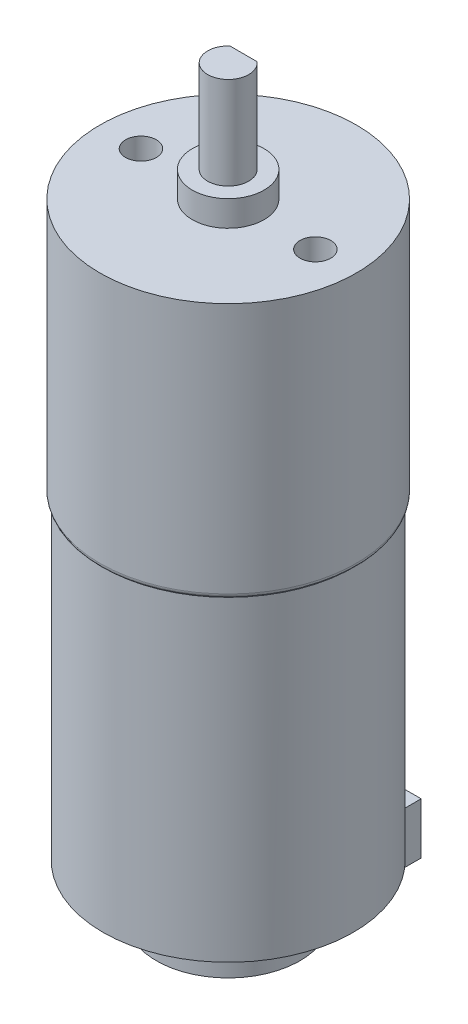
ISO-10303-21;
HEADER;
FILE_DESCRIPTION(('STEP AP214'),'2;1');
FILE_NAME('part.step','',(''),(''),'','','');
FILE_SCHEMA(('AUTOMOTIVE_DESIGN { 1 0 10303 214 1 1 1 1 }'));
ENDSEC;
DATA;
#1=APPLICATION_CONTEXT('core data for automotive mechanical design processes');
#2=APPLICATION_PROTOCOL_DEFINITION('international standard','automotive_design',2000,#1);
#3=PRODUCT_CONTEXT('',#1,'mechanical');
#4=PRODUCT('Part','Part','',(#3));
#5=PRODUCT_RELATED_PRODUCT_CATEGORY('part','',(#4));
#6=PRODUCT_DEFINITION_FORMATION('','',#4);
#7=PRODUCT_DEFINITION_CONTEXT('part definition',#1,'design');
#8=PRODUCT_DEFINITION('design','',#6,#7);
#9=PRODUCT_DEFINITION_SHAPE('','',#8);
#10=(LENGTH_UNIT() NAMED_UNIT(*) SI_UNIT(.MILLI.,.METRE.));
#11=(NAMED_UNIT(*) PLANE_ANGLE_UNIT() SI_UNIT($,.RADIAN.));
#12=(NAMED_UNIT(*) SI_UNIT($,.STERADIAN.) SOLID_ANGLE_UNIT());
#13=UNCERTAINTY_MEASURE_WITH_UNIT(LENGTH_MEASURE(1.E-05),#10,'distance_accuracy_value','');
#14=(GEOMETRIC_REPRESENTATION_CONTEXT(3) GLOBAL_UNCERTAINTY_ASSIGNED_CONTEXT((#13)) GLOBAL_UNIT_ASSIGNED_CONTEXT((#10,
#11,#12)) REPRESENTATION_CONTEXT('',''));
#15=CARTESIAN_POINT('',(0.,0.,0.));
#16=DIRECTION('',(0.,0.,1.));
#17=DIRECTION('',(1.,0.,0.));
#18=AXIS2_PLACEMENT_3D('',#15,#16,#17);
#19=CARTESIAN_POINT('',(0.,-30.8,0.));
#20=DIRECTION('',(0.,-1.,0.));
#21=DIRECTION('',(0.,0.,-1.));
#22=AXIS2_PLACEMENT_3D('',#19,#20,#21);
#23=PLANE('',#22);
#24=CARTESIAN_POINT('',(0.,-30.8,0.));
#25=DIRECTION('',(0.,-1.,0.));
#26=DIRECTION('',(0.,0.,-1.));
#27=AXIS2_PLACEMENT_3D('',#24,#25,#26);
#28=CIRCLE('',#27,7.);
#29=CARTESIAN_POINT('',(0.,-30.8,-7.));
#30=VERTEX_POINT('',#29);
#31=EDGE_CURVE('E46',#30,#30,#28,.T.);
#32=ORIENTED_EDGE('',*,*,#31,.F.);
#33=EDGE_LOOP('',(#32));
#34=FACE_BOUND('',#33,.T.);
#35=DIRECTION('',(-1.,0.,0.));
#36=VECTOR('',#35,1.);
#37=CARTESIAN_POINT('',(-4.22657274734341,-30.8,-10.4201274271041));
#38=LINE('',#37,#36);
#39=CARTESIAN_POINT('',(4.22657274734341,-30.8,-10.4201274271041));
#40=VERTEX_POINT('',#39);
#41=CARTESIAN_POINT('',(-4.22657274734341,-30.8,-10.4201274271041));
#42=VERTEX_POINT('',#41);
#43=EDGE_CURVE('E421',#40,#42,#38,.T.);
#44=ORIENTED_EDGE('',*,*,#43,.F.);
#45=DIRECTION('',(0.,0.,-1.));
#46=VECTOR('',#45,1.);
#47=CARTESIAN_POINT('',(4.22657274734341,-30.8,0.));
#48=LINE('',#47,#46);
#49=CARTESIAN_POINT('',(4.22657274734341,-30.8,-11.4444782673311));
#50=VERTEX_POINT('',#49);
#51=EDGE_CURVE('E11',#40,#50,#48,.T.);
#52=ORIENTED_EDGE('',*,*,#51,.T.);
#53=CARTESIAN_POINT('',(0.,-30.8,0.));
#54=DIRECTION('',(0.,-1.,0.));
#55=DIRECTION('',(0.,0.,-1.));
#56=AXIS2_PLACEMENT_3D('',#53,#54,#55);
#57=CIRCLE('',#56,12.2);
#58=CARTESIAN_POINT('',(-4.22657274734341,-30.8,-11.4444782673311));
#59=VERTEX_POINT('',#58);
#60=EDGE_CURVE('E167',#50,#59,#57,.T.);
#61=ORIENTED_EDGE('',*,*,#60,.T.);
#62=DIRECTION('',(0.,0.,-1.));
#63=VECTOR('',#62,1.);
#64=CARTESIAN_POINT('',(-4.22657274734341,-30.8,-14.5798725728959));
#65=LINE('',#64,#63);
#66=EDGE_CURVE('E425',#42,#59,#65,.T.);
#67=ORIENTED_EDGE('',*,*,#66,.F.);
#68=EDGE_LOOP('',(#44,#52,#61,#67));
#69=FACE_BOUND('',#68,.T.);
#70=ADVANCED_FACE('F38',(#34,#69),#23,.T.);
#71=CARTESIAN_POINT('',(0.,0.5,0.));
#72=DIRECTION('',(0.,1.,0.));
#73=DIRECTION('',(0.,0.,1.));
#74=AXIS2_PLACEMENT_3D('',#71,#72,#73);
#75=TOROIDAL_SURFACE('',#74,12.,0.5);
#76=CARTESIAN_POINT('',(0.,0.,0.));
#77=DIRECTION('',(0.,1.,0.));
#78=DIRECTION('',(0.,0.,1.));
#79=AXIS2_PLACEMENT_3D('',#76,#77,#78);
#80=CIRCLE('',#79,12.);
#81=CARTESIAN_POINT('',(0.,0.,12.));
#82=VERTEX_POINT('',#81);
#83=EDGE_CURVE('E176',#82,#82,#80,.F.);
#84=ORIENTED_EDGE('',*,*,#83,.F.);
#85=EDGE_LOOP('',(#84));
#86=FACE_BOUND('',#85,.T.);
#87=CARTESIAN_POINT('',(0.,0.5,0.));
#88=DIRECTION('',(0.,1.,0.));
#89=DIRECTION('',(0.,0.,1.));
#90=AXIS2_PLACEMENT_3D('',#87,#88,#89);
#91=CIRCLE('',#90,12.5);
#92=CARTESIAN_POINT('',(0.,0.5,12.5));
#93=VERTEX_POINT('',#92);
#94=EDGE_CURVE('E166',#93,#93,#91,.T.);
#95=ORIENTED_EDGE('',*,*,#94,.F.);
#96=EDGE_LOOP('',(#95));
#97=FACE_BOUND('',#96,.T.);
#98=ADVANCED_FACE('F40',(#86,#97),#75,.T.);
#99=CARTESIAN_POINT('',(0.,25.,0.));
#100=DIRECTION('',(0.,-1.,0.));
#101=DIRECTION('',(0.,0.,-1.));
#102=AXIS2_PLACEMENT_3D('',#99,#100,#101);
#103=CYLINDRICAL_SURFACE('',#102,12.5);
#104=ORIENTED_EDGE('',*,*,#94,.T.);
#105=EDGE_LOOP('',(#104));
#106=FACE_BOUND('',#105,.T.);
#107=CARTESIAN_POINT('',(0.,25.,0.));
#108=DIRECTION('',(0.,1.,0.));
#109=DIRECTION('',(0.,0.,1.));
#110=AXIS2_PLACEMENT_3D('',#107,#108,#109);
#111=CIRCLE('',#110,12.5);
#112=CARTESIAN_POINT('',(0.,25.,12.5));
#113=VERTEX_POINT('',#112);
#114=EDGE_CURVE('E170',#113,#113,#111,.T.);
#115=ORIENTED_EDGE('',*,*,#114,.F.);
#116=EDGE_LOOP('',(#115));
#117=FACE_BOUND('',#116,.T.);
#118=ADVANCED_FACE('F181',(#106,#117),#103,.T.);
#119=CARTESIAN_POINT('',(0.,25.,0.));
#120=DIRECTION('',(0.,1.,0.));
#121=DIRECTION('',(0.,0.,1.));
#122=AXIS2_PLACEMENT_3D('',#119,#120,#121);
#123=PLANE('',#122);
#124=CARTESIAN_POINT('',(-8.5,25.,0.));
#125=DIRECTION('',(0.,1.,0.));
#126=DIRECTION('',(0.,0.,1.));
#127=AXIS2_PLACEMENT_3D('',#124,#125,#126);
#128=CIRCLE('',#127,1.5);
#129=CARTESIAN_POINT('',(-8.5,25.,1.5));
#130=VERTEX_POINT('',#129);
#131=EDGE_CURVE('E136',#130,#130,#128,.T.);
#132=ORIENTED_EDGE('',*,*,#131,.F.);
#133=EDGE_LOOP('',(#132));
#134=FACE_BOUND('',#133,.T.);
#135=CARTESIAN_POINT('',(8.5,25.,0.));
#136=DIRECTION('',(0.,1.,0.));
#137=DIRECTION('',(0.,0.,1.));
#138=AXIS2_PLACEMENT_3D('',#135,#136,#137);
#139=CIRCLE('',#138,1.5);
#140=CARTESIAN_POINT('',(8.5,25.,1.5));
#141=VERTEX_POINT('',#140);
#142=EDGE_CURVE('E123',#141,#141,#139,.T.);
#143=ORIENTED_EDGE('',*,*,#142,.F.);
#144=EDGE_LOOP('',(#143));
#145=FACE_BOUND('',#144,.T.);
#146=CARTESIAN_POINT('',(0.,25.,0.));
#147=DIRECTION('',(0.,1.,0.));
#148=DIRECTION('',(0.,0.,1.));
#149=AXIS2_PLACEMENT_3D('',#146,#147,#148);
#150=CIRCLE('',#149,3.5);
#151=CARTESIAN_POINT('',(0.,25.,3.5));
#152=VERTEX_POINT('',#151);
#153=EDGE_CURVE('E160',#152,#152,#150,.T.);
#154=ORIENTED_EDGE('',*,*,#153,.F.);
#155=EDGE_LOOP('',(#154));
#156=FACE_BOUND('',#155,.T.);
#157=ORIENTED_EDGE('',*,*,#114,.T.);
#158=EDGE_LOOP('',(#157));
#159=FACE_BOUND('',#158,.T.);
#160=ADVANCED_FACE('F190',(#134,#145,#156,#159),#123,.T.);
#161=CARTESIAN_POINT('',(0.,-30.8,0.));
#162=DIRECTION('',(0.,1.,0.));
#163=DIRECTION('',(0.,0.,1.));
#164=AXIS2_PLACEMENT_3D('',#161,#162,#163);
#165=CYLINDRICAL_SURFACE('',#164,12.2);
#166=ORIENTED_EDGE('',*,*,#60,.F.);
#167=EDGE_CURVE('E171',#59,#50,#57,.T.);
#168=ORIENTED_EDGE('',*,*,#167,.F.);
#169=EDGE_LOOP('',(#166,#168));
#170=FACE_BOUND('',#169,.T.);
#171=CARTESIAN_POINT('',(0.,0.,0.));
#172=DIRECTION('',(0.,-1.,0.));
#173=DIRECTION('',(0.,0.,-1.));
#174=AXIS2_PLACEMENT_3D('',#171,#172,#173);
#175=CIRCLE('',#174,12.2);
#176=CARTESIAN_POINT('',(0.,0.,-12.2));
#177=VERTEX_POINT('',#176);
#178=EDGE_CURVE('E163',#177,#177,#175,.T.);
#179=ORIENTED_EDGE('',*,*,#178,.T.);
#180=EDGE_LOOP('',(#179));
#181=FACE_BOUND('',#180,.T.);
#182=ADVANCED_FACE('F199',(#170,#181),#165,.T.);
#183=CARTESIAN_POINT('',(0.,0.,0.));
#184=DIRECTION('',(0.,-1.,0.));
#185=DIRECTION('',(0.,0.,-1.));
#186=AXIS2_PLACEMENT_3D('',#183,#184,#185);
#187=PLANE('',#186);
#188=ORIENTED_EDGE('',*,*,#83,.T.);
#189=EDGE_LOOP('',(#188));
#190=FACE_BOUND('',#189,.T.);
#191=ORIENTED_EDGE('',*,*,#178,.F.);
#192=EDGE_LOOP('',(#191));
#193=FACE_BOUND('',#192,.T.);
#194=ADVANCED_FACE('F195',(#190,#193),#187,.F.);
#195=CARTESIAN_POINT('',(0.,27.5,0.));
#196=DIRECTION('',(0.,-1.,0.));
#197=DIRECTION('',(0.,0.,-1.));
#198=AXIS2_PLACEMENT_3D('',#195,#196,#197);
#199=CYLINDRICAL_SURFACE('',#198,3.5);
#200=CARTESIAN_POINT('',(0.,27.5,0.));
#201=DIRECTION('',(0.,1.,0.));
#202=DIRECTION('',(0.,0.,1.));
#203=AXIS2_PLACEMENT_3D('',#200,#201,#202);
#204=CIRCLE('',#203,3.5);
#205=CARTESIAN_POINT('',(0.,27.5,3.5));
#206=VERTEX_POINT('',#205);
#207=EDGE_CURVE('E157',#206,#206,#204,.T.);
#208=ORIENTED_EDGE('',*,*,#207,.F.);
#209=EDGE_LOOP('',(#208));
#210=FACE_BOUND('',#209,.T.);
#211=ORIENTED_EDGE('',*,*,#153,.T.);
#212=EDGE_LOOP('',(#211));
#213=FACE_BOUND('',#212,.T.);
#214=ADVANCED_FACE('F198',(#210,#213),#199,.T.);
#215=CARTESIAN_POINT('',(0.,27.5,0.));
#216=DIRECTION('',(0.,1.,0.));
#217=DIRECTION('',(0.,0.,1.));
#218=AXIS2_PLACEMENT_3D('',#215,#216,#217);
#219=PLANE('',#218);
#220=CARTESIAN_POINT('',(0.,27.5,0.));
#221=DIRECTION('',(0.,1.,0.));
#222=DIRECTION('',(0.,0.,1.));
#223=AXIS2_PLACEMENT_3D('',#220,#221,#222);
#224=CIRCLE('',#223,2.);
#225=CARTESIAN_POINT('',(0.,27.5,2.));
#226=VERTEX_POINT('',#225);
#227=EDGE_CURVE('E131',#226,#226,#224,.T.);
#228=ORIENTED_EDGE('',*,*,#227,.F.);
#229=EDGE_LOOP('',(#228));
#230=FACE_BOUND('',#229,.T.);
#231=ORIENTED_EDGE('',*,*,#207,.T.);
#232=EDGE_LOOP('',(#231));
#233=FACE_BOUND('',#232,.T.);
#234=ADVANCED_FACE('F215',(#230,#233),#219,.T.);
#235=CARTESIAN_POINT('',(0.,36.5,0.));
#236=DIRECTION('',(0.,-1.,0.));
#237=DIRECTION('',(0.,0.,-1.));
#238=AXIS2_PLACEMENT_3D('',#235,#236,#237);
#239=CYLINDRICAL_SURFACE('',#238,2.);
#240=CARTESIAN_POINT('',(0.,36.5,0.));
#241=DIRECTION('',(0.,1.,0.));
#242=DIRECTION('',(0.,0.,1.));
#243=AXIS2_PLACEMENT_3D('',#240,#241,#242);
#244=CIRCLE('',#243,2.);
#245=CARTESIAN_POINT('',(-1.3228756555323,36.5,-1.5));
#246=VERTEX_POINT('',#245);
#247=CARTESIAN_POINT('',(1.3228756555323,36.5,-1.5));
#248=VERTEX_POINT('',#247);
#249=EDGE_CURVE('E153',#246,#248,#244,.T.);
#250=ORIENTED_EDGE('',*,*,#249,.F.);
#251=DIRECTION('',(0.,1.,0.));
#252=VECTOR('',#251,1.);
#253=CARTESIAN_POINT('',(-1.3228756555323,28.5,-1.5));
#254=LINE('',#253,#252);
#255=CARTESIAN_POINT('',(-1.3228756555323,28.5,-1.5));
#256=VERTEX_POINT('',#255);
#257=EDGE_CURVE('E61',#256,#246,#254,.T.);
#258=ORIENTED_EDGE('',*,*,#257,.F.);
#259=CARTESIAN_POINT('',(0.,28.5,0.));
#260=DIRECTION('',(0.,1.,0.));
#261=DIRECTION('',(0.,0.,-1.));
#262=AXIS2_PLACEMENT_3D('',#259,#260,#261);
#263=CIRCLE('',#262,2.);
#264=CARTESIAN_POINT('',(1.3228756555323,28.5,-1.5));
#265=VERTEX_POINT('',#264);
#266=EDGE_CURVE('E144',#265,#256,#263,.T.);
#267=ORIENTED_EDGE('',*,*,#266,.F.);
#268=DIRECTION('',(0.,1.,0.));
#269=VECTOR('',#268,1.);
#270=CARTESIAN_POINT('',(1.3228756555323,28.5,-1.5));
#271=LINE('',#270,#269);
#272=EDGE_CURVE('E150',#265,#248,#271,.T.);
#273=ORIENTED_EDGE('',*,*,#272,.T.);
#274=EDGE_LOOP('',(#250,#258,#267,#273));
#275=FACE_BOUND('',#274,.T.);
#276=ORIENTED_EDGE('',*,*,#227,.T.);
#277=EDGE_LOOP('',(#276));
#278=FACE_BOUND('',#277,.T.);
#279=ADVANCED_FACE('F219',(#275,#278),#239,.T.);
#280=CARTESIAN_POINT('',(0.,36.5,0.));
#281=DIRECTION('',(0.,1.,0.));
#282=DIRECTION('',(0.,0.,1.));
#283=AXIS2_PLACEMENT_3D('',#280,#281,#282);
#284=PLANE('',#283);
#285=DIRECTION('',(1.,0.,0.));
#286=VECTOR('',#285,1.);
#287=CARTESIAN_POINT('',(1.3228756555323,36.5,-1.5));
#288=LINE('',#287,#286);
#289=EDGE_CURVE('E135',#246,#248,#288,.T.);
#290=ORIENTED_EDGE('',*,*,#289,.F.);
#291=ORIENTED_EDGE('',*,*,#249,.T.);
#292=EDGE_LOOP('',(#290,#291));
#293=FACE_BOUND('',#292,.T.);
#294=ADVANCED_FACE('F223',(#293),#284,.T.);
#295=CARTESIAN_POINT('',(1.3228756555323,28.5,-1.5));
#296=DIRECTION('',(0.,0.,1.));
#297=DIRECTION('',(1.,0.,0.));
#298=AXIS2_PLACEMENT_3D('',#295,#296,#297);
#299=PLANE('',#298);
#300=ORIENTED_EDGE('',*,*,#289,.T.);
#301=ORIENTED_EDGE('',*,*,#272,.F.);
#302=DIRECTION('',(1.,0.,0.));
#303=VECTOR('',#302,1.);
#304=CARTESIAN_POINT('',(1.3228756555323,28.5,-1.5));
#305=LINE('',#304,#303);
#306=EDGE_CURVE('E146',#256,#265,#305,.T.);
#307=ORIENTED_EDGE('',*,*,#306,.F.);
#308=ORIENTED_EDGE('',*,*,#257,.T.);
#309=EDGE_LOOP('',(#300,#301,#307,#308));
#310=FACE_BOUND('',#309,.T.);
#311=ADVANCED_FACE('F227',(#310),#299,.F.);
#312=CARTESIAN_POINT('',(0.,28.5,0.));
#313=DIRECTION('',(0.,-1.,0.));
#314=DIRECTION('',(0.,0.,-1.));
#315=AXIS2_PLACEMENT_3D('',#312,#313,#314);
#316=PLANE('',#315);
#317=ORIENTED_EDGE('',*,*,#266,.T.);
#318=ORIENTED_EDGE('',*,*,#306,.T.);
#319=EDGE_LOOP('',(#317,#318));
#320=FACE_BOUND('',#319,.T.);
#321=ADVANCED_FACE('F231',(#320),#316,.F.);
#322=CARTESIAN_POINT('',(8.5,20.,0.));
#323=DIRECTION('',(0.,1.,0.));
#324=DIRECTION('',(0.,0.,1.));
#325=AXIS2_PLACEMENT_3D('',#322,#323,#324);
#326=CYLINDRICAL_SURFACE('',#325,1.5);
#327=CARTESIAN_POINT('',(8.5,20.,0.));
#328=DIRECTION('',(0.,1.,0.));
#329=DIRECTION('',(0.,0.,1.));
#330=AXIS2_PLACEMENT_3D('',#327,#328,#329);
#331=CIRCLE('',#330,1.5);
#332=CARTESIAN_POINT('',(8.5,20.,1.5));
#333=VERTEX_POINT('',#332);
#334=EDGE_CURVE('E139',#333,#333,#331,.T.);
#335=ORIENTED_EDGE('',*,*,#334,.F.);
#336=EDGE_LOOP('',(#335));
#337=FACE_BOUND('',#336,.T.);
#338=ORIENTED_EDGE('',*,*,#142,.T.);
#339=EDGE_LOOP('',(#338));
#340=FACE_BOUND('',#339,.T.);
#341=ADVANCED_FACE('F234',(#337,#340),#326,.F.);
#342=CARTESIAN_POINT('',(8.5,20.,0.));
#343=DIRECTION('',(0.,1.,0.));
#344=DIRECTION('',(0.,0.,1.));
#345=AXIS2_PLACEMENT_3D('',#342,#343,#344);
#346=PLANE('',#345);
#347=ORIENTED_EDGE('',*,*,#334,.T.);
#348=EDGE_LOOP('',(#347));
#349=FACE_BOUND('',#348,.T.);
#350=ADVANCED_FACE('F238',(#349),#346,.T.);
#351=CARTESIAN_POINT('',(-8.5,20.,0.));
#352=DIRECTION('',(0.,1.,0.));
#353=DIRECTION('',(0.,0.,1.));
#354=AXIS2_PLACEMENT_3D('',#351,#352,#353);
#355=CYLINDRICAL_SURFACE('',#354,1.5);
#356=CARTESIAN_POINT('',(-8.5,20.,0.));
#357=DIRECTION('',(0.,1.,0.));
#358=DIRECTION('',(0.,0.,1.));
#359=AXIS2_PLACEMENT_3D('',#356,#357,#358);
#360=CIRCLE('',#359,1.5);
#361=CARTESIAN_POINT('',(-8.5,20.,1.5));
#362=VERTEX_POINT('',#361);
#363=EDGE_CURVE('E132',#362,#362,#360,.T.);
#364=ORIENTED_EDGE('',*,*,#363,.F.);
#365=EDGE_LOOP('',(#364));
#366=FACE_BOUND('',#365,.T.);
#367=ORIENTED_EDGE('',*,*,#131,.T.);
#368=EDGE_LOOP('',(#367));
#369=FACE_BOUND('',#368,.T.);
#370=ADVANCED_FACE('F242',(#366,#369),#355,.F.);
#371=CARTESIAN_POINT('',(-8.5,20.,0.));
#372=DIRECTION('',(0.,1.,0.));
#373=DIRECTION('',(0.,0.,1.));
#374=AXIS2_PLACEMENT_3D('',#371,#372,#373);
#375=PLANE('',#374);
#376=ORIENTED_EDGE('',*,*,#363,.T.);
#377=EDGE_LOOP('',(#376));
#378=FACE_BOUND('',#377,.T.);
#379=ADVANCED_FACE('F246',(#378),#375,.T.);
#380=CARTESIAN_POINT('',(0.,-35.8,0.));
#381=DIRECTION('',(0.,1.,0.));
#382=DIRECTION('',(0.,0.,1.));
#383=AXIS2_PLACEMENT_3D('',#380,#381,#382);
#384=CYLINDRICAL_SURFACE('',#383,7.);
#385=CARTESIAN_POINT('',(0.,-35.8,0.));
#386=DIRECTION('',(0.,-1.,0.));
#387=DIRECTION('',(0.,0.,-1.));
#388=AXIS2_PLACEMENT_3D('',#385,#386,#387);
#389=CIRCLE('',#388,7.);
#390=CARTESIAN_POINT('',(0.,-35.8,-7.));
#391=VERTEX_POINT('',#390);
#392=EDGE_CURVE('E120',#391,#391,#389,.T.);
#393=ORIENTED_EDGE('',*,*,#392,.F.);
#394=EDGE_LOOP('',(#393));
#395=FACE_BOUND('',#394,.T.);
#396=ORIENTED_EDGE('',*,*,#31,.T.);
#397=EDGE_LOOP('',(#396));
#398=FACE_BOUND('',#397,.T.);
#399=ADVANCED_FACE('F250',(#395,#398),#384,.T.);
#400=CARTESIAN_POINT('',(0.,-35.8,0.));
#401=DIRECTION('',(0.,-1.,0.));
#402=DIRECTION('',(0.,0.,-1.));
#403=AXIS2_PLACEMENT_3D('',#400,#401,#402);
#404=PLANE('',#403);
#405=ORIENTED_EDGE('',*,*,#392,.T.);
#406=EDGE_LOOP('',(#405));
#407=FACE_BOUND('',#406,.T.);
#408=ADVANCED_FACE('F254',(#407),#404,.T.);
#409=CARTESIAN_POINT('',(4.22657274734341,-35.8,-14.5798725728959));
#410=DIRECTION('',(-1.,0.,0.));
#411=DIRECTION('',(0.,0.,1.));
#412=AXIS2_PLACEMENT_3D('',#409,#410,#411);
#413=PLANE('',#412);
#414=DIRECTION('',(0.,0.,1.));
#415=VECTOR('',#414,1.);
#416=CARTESIAN_POINT('',(4.22657274734341,-30.8,-14.5798725728959));
#417=LINE('',#416,#415);
#418=CARTESIAN_POINT('',(4.22657274734341,-30.8,-14.5798725728959));
#419=VERTEX_POINT('',#418);
#420=EDGE_CURVE('E418',#419,#50,#417,.T.);
#421=ORIENTED_EDGE('',*,*,#420,.T.);
#422=ORIENTED_EDGE('',*,*,#51,.F.);
#423=DIRECTION('',(0.,1.,0.));
#424=VECTOR('',#423,1.);
#425=CARTESIAN_POINT('',(4.22657274734341,-35.8,-10.4201274271041));
#426=LINE('',#425,#424);
#427=CARTESIAN_POINT('',(4.22657274734341,-35.8,-10.4201274271041));
#428=VERTEX_POINT('',#427);
#429=EDGE_CURVE('E103',#428,#40,#426,.T.);
#430=ORIENTED_EDGE('',*,*,#429,.F.);
#431=DIRECTION('',(0.,0.,1.));
#432=VECTOR('',#431,1.);
#433=CARTESIAN_POINT('',(4.22657274734341,-35.8,-14.5798725728959));
#434=LINE('',#433,#432);
#435=CARTESIAN_POINT('',(4.22657274734341,-35.8,-14.5798725728959));
#436=VERTEX_POINT('',#435);
#437=EDGE_CURVE('E107',#436,#428,#434,.T.);
#438=ORIENTED_EDGE('',*,*,#437,.F.);
#439=DIRECTION('',(0.,1.,0.));
#440=VECTOR('',#439,1.);
#441=CARTESIAN_POINT('',(4.22657274734341,-35.8,-14.5798725728959));
#442=LINE('',#441,#440);
#443=EDGE_CURVE('E420',#436,#419,#442,.T.);
#444=ORIENTED_EDGE('',*,*,#443,.T.);
#445=EDGE_LOOP('',(#421,#422,#430,#438,#444));
#446=FACE_BOUND('',#445,.T.);
#447=ADVANCED_FACE('F119',(#446),#413,.F.);
#448=CARTESIAN_POINT('',(-4.22657274734341,-35.8,-10.4201274271041));
#449=DIRECTION('',(0.,0.,-1.));
#450=DIRECTION('',(-1.,0.,0.));
#451=AXIS2_PLACEMENT_3D('',#448,#449,#450);
#452=PLANE('',#451);
#453=ORIENTED_EDGE('',*,*,#43,.T.);
#454=DIRECTION('',(0.,1.,0.));
#455=VECTOR('',#454,1.);
#456=CARTESIAN_POINT('',(-4.22657274734341,-35.8,-10.4201274271041));
#457=LINE('',#456,#455);
#458=CARTESIAN_POINT('',(-4.22657274734341,-35.8,-10.4201274271041));
#459=VERTEX_POINT('',#458);
#460=EDGE_CURVE('E53',#459,#42,#457,.T.);
#461=ORIENTED_EDGE('',*,*,#460,.F.);
#462=DIRECTION('',(-1.,0.,0.));
#463=VECTOR('',#462,1.);
#464=CARTESIAN_POINT('',(-4.22657274734341,-35.8,-10.4201274271041));
#465=LINE('',#464,#463);
#466=EDGE_CURVE('E99',#428,#459,#465,.T.);
#467=ORIENTED_EDGE('',*,*,#466,.F.);
#468=ORIENTED_EDGE('',*,*,#429,.T.);
#469=EDGE_LOOP('',(#453,#461,#467,#468));
#470=FACE_BOUND('',#469,.T.);
#471=ADVANCED_FACE('F101',(#470),#452,.F.);
#472=CARTESIAN_POINT('',(-4.22657274734341,-35.8,-14.5798725728959));
#473=DIRECTION('',(1.,0.,0.));
#474=DIRECTION('',(0.,0.,-1.));
#475=AXIS2_PLACEMENT_3D('',#472,#473,#474);
#476=PLANE('',#475);
#477=ORIENTED_EDGE('',*,*,#66,.T.);
#478=CARTESIAN_POINT('',(-4.22657274734341,-30.8,-14.5798725728959));
#479=VERTEX_POINT('',#478);
#480=EDGE_CURVE('E419',#59,#479,#65,.T.);
#481=ORIENTED_EDGE('',*,*,#480,.T.);
#482=DIRECTION('',(0.,1.,0.));
#483=VECTOR('',#482,1.);
#484=CARTESIAN_POINT('',(-4.22657274734341,-35.8,-14.5798725728959));
#485=LINE('',#484,#483);
#486=CARTESIAN_POINT('',(-4.22657274734341,-35.8,-14.5798725728959));
#487=VERTEX_POINT('',#486);
#488=EDGE_CURVE('E125',#487,#479,#485,.T.);
#489=ORIENTED_EDGE('',*,*,#488,.F.);
#490=DIRECTION('',(0.,0.,-1.));
#491=VECTOR('',#490,1.);
#492=CARTESIAN_POINT('',(-4.22657274734341,-35.8,-14.5798725728959));
#493=LINE('',#492,#491);
#494=EDGE_CURVE('E106',#459,#487,#493,.T.);
#495=ORIENTED_EDGE('',*,*,#494,.F.);
#496=ORIENTED_EDGE('',*,*,#460,.T.);
#497=EDGE_LOOP('',(#477,#481,#489,#495,#496));
#498=FACE_BOUND('',#497,.T.);
#499=ADVANCED_FACE('F263',(#498),#476,.F.);
#500=CARTESIAN_POINT('',(-4.22657274734341,-35.8,-14.5798725728959));
#501=DIRECTION('',(0.,0.,1.));
#502=DIRECTION('',(1.,0.,0.));
#503=AXIS2_PLACEMENT_3D('',#500,#501,#502);
#504=PLANE('',#503);
#505=DIRECTION('',(1.,0.,0.));
#506=VECTOR('',#505,1.);
#507=CARTESIAN_POINT('',(-4.22657274734341,-30.8,-14.5798725728959));
#508=LINE('',#507,#506);
#509=EDGE_CURVE('E116',#479,#419,#508,.T.);
#510=ORIENTED_EDGE('',*,*,#509,.T.);
#511=ORIENTED_EDGE('',*,*,#443,.F.);
#512=DIRECTION('',(1.,0.,0.));
#513=VECTOR('',#512,1.);
#514=CARTESIAN_POINT('',(-4.22657274734341,-35.8,-14.5798725728959));
#515=LINE('',#514,#513);
#516=EDGE_CURVE('E112',#487,#436,#515,.T.);
#517=ORIENTED_EDGE('',*,*,#516,.F.);
#518=ORIENTED_EDGE('',*,*,#488,.T.);
#519=EDGE_LOOP('',(#510,#511,#517,#518));
#520=FACE_BOUND('',#519,.T.);
#521=ADVANCED_FACE('F266',(#520),#504,.F.);
#522=CARTESIAN_POINT('',(0.,-35.8,0.));
#523=DIRECTION('',(0.,1.,0.));
#524=DIRECTION('',(0.,0.,1.));
#525=AXIS2_PLACEMENT_3D('',#522,#523,#524);
#526=PLANE('',#525);
#527=ORIENTED_EDGE('',*,*,#437,.T.);
#528=ORIENTED_EDGE('',*,*,#466,.T.);
#529=ORIENTED_EDGE('',*,*,#494,.T.);
#530=ORIENTED_EDGE('',*,*,#516,.T.);
#531=EDGE_LOOP('',(#527,#528,#529,#530));
#532=FACE_BOUND('',#531,.T.);
#533=ADVANCED_FACE('F110',(#532),#526,.F.);
#534=CARTESIAN_POINT('',(0.,-30.8,0.));
#535=DIRECTION('',(0.,1.,0.));
#536=DIRECTION('',(0.,0.,1.));
#537=AXIS2_PLACEMENT_3D('',#534,#535,#536);
#538=PLANE('',#537);
#539=ORIENTED_EDGE('',*,*,#167,.T.);
#540=ORIENTED_EDGE('',*,*,#420,.F.);
#541=ORIENTED_EDGE('',*,*,#509,.F.);
#542=ORIENTED_EDGE('',*,*,#480,.F.);
#543=EDGE_LOOP('',(#539,#540,#541,#542));
#544=FACE_BOUND('',#543,.T.);
#545=ADVANCED_FACE('F270',(#544),#538,.T.);
#546=CLOSED_SHELL('',(#70,#98,#118,#160,#182,#194,#214,#234,#279,#294,#311,#321,#341,#350,#370,
#379,#399,#408,#447,#471,#499,#521,#533,#545));
#547=MANIFOLD_SOLID_BREP('B2',#546);
#548=ADVANCED_BREP_SHAPE_REPRESENTATION('',(#18,#547),#14);
#549=SHAPE_DEFINITION_REPRESENTATION(#9,#548);
ENDSEC;
END-ISO-10303-21;
